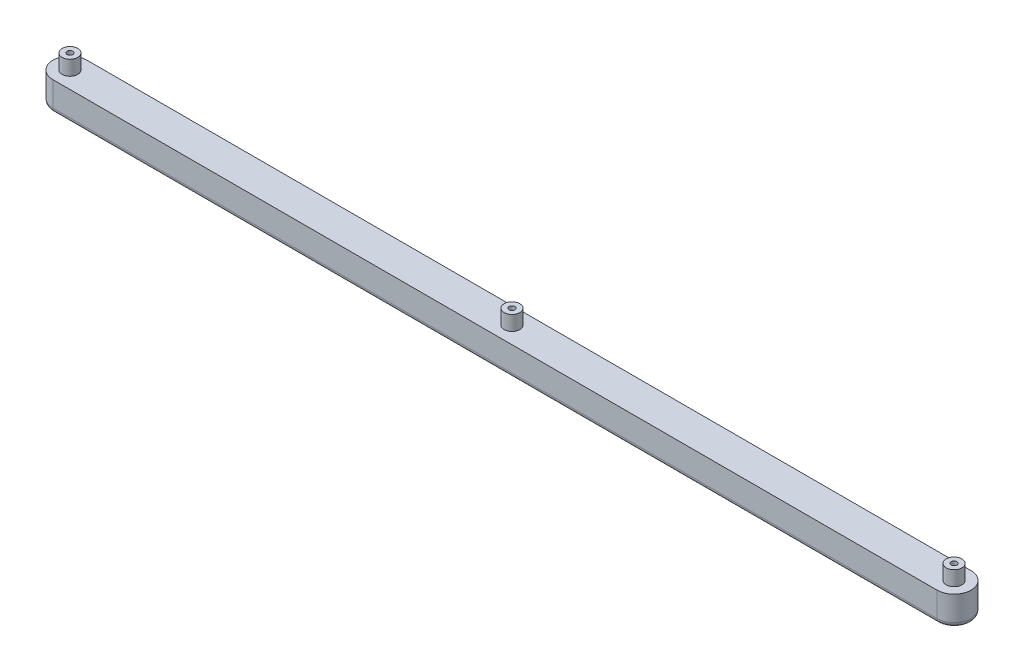
ISO-10303-21;
HEADER;
FILE_DESCRIPTION(('STEP AP214'),'2;1');
FILE_NAME('part.step','',(''),(''),'','','');
FILE_SCHEMA(('AUTOMOTIVE_DESIGN { 1 0 10303 214 1 1 1 1 }'));
ENDSEC;
DATA;
#1=APPLICATION_CONTEXT('core data for automotive mechanical design processes');
#2=APPLICATION_PROTOCOL_DEFINITION('international standard','automotive_design',2000,#1);
#3=PRODUCT_CONTEXT('',#1,'mechanical');
#4=PRODUCT('Part','Part','',(#3));
#5=PRODUCT_RELATED_PRODUCT_CATEGORY('part','',(#4));
#6=PRODUCT_DEFINITION_FORMATION('','',#4);
#7=PRODUCT_DEFINITION_CONTEXT('part definition',#1,'design');
#8=PRODUCT_DEFINITION('design','',#6,#7);
#9=PRODUCT_DEFINITION_SHAPE('','',#8);
#10=(LENGTH_UNIT() NAMED_UNIT(*) SI_UNIT(.MILLI.,.METRE.));
#11=(NAMED_UNIT(*) PLANE_ANGLE_UNIT() SI_UNIT($,.RADIAN.));
#12=(NAMED_UNIT(*) SI_UNIT($,.STERADIAN.) SOLID_ANGLE_UNIT());
#13=UNCERTAINTY_MEASURE_WITH_UNIT(LENGTH_MEASURE(1.E-05),#10,'distance_accuracy_value','');
#14=(GEOMETRIC_REPRESENTATION_CONTEXT(3) GLOBAL_UNCERTAINTY_ASSIGNED_CONTEXT((#13)) GLOBAL_UNIT_ASSIGNED_CONTEXT((#10,
#11,#12)) REPRESENTATION_CONTEXT('',''));
#15=CARTESIAN_POINT('',(0.,0.,0.));
#16=DIRECTION('',(0.,0.,1.));
#17=DIRECTION('',(1.,0.,0.));
#18=AXIS2_PLACEMENT_3D('',#15,#16,#17);
#19=CARTESIAN_POINT('',(-90.,3.,0.));
#20=DIRECTION('',(0.,-1.,0.));
#21=DIRECTION('',(0.,0.,-1.));
#22=AXIS2_PLACEMENT_3D('',#19,#20,#21);
#23=CYLINDRICAL_SURFACE('',#22,3.44999999998838);
#24=DIRECTION('',(0.,-1.,0.));
#25=VECTOR('',#24,1.);
#26=CARTESIAN_POINT('',(-90.,3.,-3.44999999998838));
#27=LINE('',#26,#25);
#28=CARTESIAN_POINT('',(-90.,3.,-3.44999999998838));
#29=VERTEX_POINT('',#28);
#30=CARTESIAN_POINT('',(-90.,-2.,-3.44999999998838));
#31=VERTEX_POINT('',#30);
#32=EDGE_CURVE('E160',#29,#31,#27,.T.);
#33=ORIENTED_EDGE('',*,*,#32,.T.);
#34=CARTESIAN_POINT('',(-90.,-2.,0.));
#35=DIRECTION('',(0.,1.,0.));
#36=DIRECTION('',(0.,0.,1.));
#37=AXIS2_PLACEMENT_3D('',#34,#35,#36);
#38=CIRCLE('',#37,3.44999999998838);
#39=CARTESIAN_POINT('',(-90.,-2.,3.44999999998838));
#40=VERTEX_POINT('',#39);
#41=EDGE_CURVE('E11',#31,#40,#38,.T.);
#42=ORIENTED_EDGE('',*,*,#41,.T.);
#43=DIRECTION('',(0.,-1.,0.));
#44=VECTOR('',#43,1.);
#45=CARTESIAN_POINT('',(-90.,3.,3.44999999998838));
#46=LINE('',#45,#44);
#47=CARTESIAN_POINT('',(-90.,3.,3.44999999998838));
#48=VERTEX_POINT('',#47);
#49=EDGE_CURVE('E100',#48,#40,#46,.T.);
#50=ORIENTED_EDGE('',*,*,#49,.F.);
#51=CARTESIAN_POINT('',(-90.,3.,0.));
#52=DIRECTION('',(0.,1.,0.));
#53=DIRECTION('',(0.,0.,1.));
#54=AXIS2_PLACEMENT_3D('',#51,#52,#53);
#55=CIRCLE('',#54,3.44999999998838);
#56=EDGE_CURVE('E106',#29,#48,#55,.T.);
#57=ORIENTED_EDGE('',*,*,#56,.F.);
#58=EDGE_LOOP('',(#33,#42,#50,#57));
#59=FACE_BOUND('',#58,.T.);
#60=ADVANCED_FACE('F39',(#59),#23,.T.);
#61=CARTESIAN_POINT('',(-90.,3.,3.44999999998838));
#62=DIRECTION('',(0.,0.,-1.));
#63=DIRECTION('',(-1.,0.,0.));
#64=AXIS2_PLACEMENT_3D('',#61,#62,#63);
#65=PLANE('',#64);
#66=ORIENTED_EDGE('',*,*,#49,.T.);
#67=DIRECTION('',(1.,0.,0.));
#68=VECTOR('',#67,1.);
#69=CARTESIAN_POINT('',(-90.,-2.,3.44999999998838));
#70=LINE('',#69,#68);
#71=CARTESIAN_POINT('',(90.,-2.,3.44999999998838));
#72=VERTEX_POINT('',#71);
#73=EDGE_CURVE('E116',#40,#72,#70,.T.);
#74=ORIENTED_EDGE('',*,*,#73,.T.);
#75=DIRECTION('',(0.,-1.,0.));
#76=VECTOR('',#75,1.);
#77=CARTESIAN_POINT('',(90.,3.,3.44999999998838));
#78=LINE('',#77,#76);
#79=CARTESIAN_POINT('',(90.,3.,3.44999999998838));
#80=VERTEX_POINT('',#79);
#81=EDGE_CURVE('E102',#80,#72,#78,.T.);
#82=ORIENTED_EDGE('',*,*,#81,.F.);
#83=DIRECTION('',(1.,0.,0.));
#84=VECTOR('',#83,1.);
#85=CARTESIAN_POINT('',(-90.,3.,3.44999999998838));
#86=LINE('',#85,#84);
#87=EDGE_CURVE('E95',#48,#80,#86,.T.);
#88=ORIENTED_EDGE('',*,*,#87,.F.);
#89=EDGE_LOOP('',(#66,#74,#82,#88));
#90=FACE_BOUND('',#89,.T.);
#91=ADVANCED_FACE('F97',(#90),#65,.F.);
#92=CARTESIAN_POINT('',(90.,3.,0.));
#93=DIRECTION('',(0.,-1.,0.));
#94=DIRECTION('',(0.,0.,-1.));
#95=AXIS2_PLACEMENT_3D('',#92,#93,#94);
#96=CYLINDRICAL_SURFACE('',#95,3.44999999998838);
#97=ORIENTED_EDGE('',*,*,#81,.T.);
#98=CARTESIAN_POINT('',(90.,-2.,0.));
#99=DIRECTION('',(0.,1.,0.));
#100=DIRECTION('',(0.,0.,1.));
#101=AXIS2_PLACEMENT_3D('',#98,#99,#100);
#102=CIRCLE('',#101,3.44999999998838);
#103=CARTESIAN_POINT('',(90.,-2.,-3.44999999998838));
#104=VERTEX_POINT('',#103);
#105=EDGE_CURVE('E63',#72,#104,#102,.T.);
#106=ORIENTED_EDGE('',*,*,#105,.T.);
#107=DIRECTION('',(0.,-1.,0.));
#108=VECTOR('',#107,1.);
#109=CARTESIAN_POINT('',(90.,3.,-3.44999999998838));
#110=LINE('',#109,#108);
#111=CARTESIAN_POINT('',(90.,3.,-3.44999999998838));
#112=VERTEX_POINT('',#111);
#113=EDGE_CURVE('E120',#112,#104,#110,.T.);
#114=ORIENTED_EDGE('',*,*,#113,.F.);
#115=CARTESIAN_POINT('',(90.,3.,0.));
#116=DIRECTION('',(0.,1.,0.));
#117=DIRECTION('',(0.,0.,1.));
#118=AXIS2_PLACEMENT_3D('',#115,#116,#117);
#119=CIRCLE('',#118,3.44999999998838);
#120=EDGE_CURVE('E105',#80,#112,#119,.T.);
#121=ORIENTED_EDGE('',*,*,#120,.F.);
#122=EDGE_LOOP('',(#97,#106,#114,#121));
#123=FACE_BOUND('',#122,.T.);
#124=ADVANCED_FACE('F170',(#123),#96,.T.);
#125=CARTESIAN_POINT('',(-90.,3.,-3.44999999998838));
#126=DIRECTION('',(0.,0.,1.));
#127=DIRECTION('',(1.,0.,0.));
#128=AXIS2_PLACEMENT_3D('',#125,#126,#127);
#129=PLANE('',#128);
#130=ORIENTED_EDGE('',*,*,#113,.T.);
#131=DIRECTION('',(-1.,0.,0.));
#132=VECTOR('',#131,1.);
#133=CARTESIAN_POINT('',(-90.,-2.,-3.44999999998838));
#134=LINE('',#133,#132);
#135=EDGE_CURVE('E48',#104,#31,#134,.T.);
#136=ORIENTED_EDGE('',*,*,#135,.T.);
#137=ORIENTED_EDGE('',*,*,#32,.F.);
#138=DIRECTION('',(-1.,0.,0.));
#139=VECTOR('',#138,1.);
#140=CARTESIAN_POINT('',(-90.,3.,-3.44999999998838));
#141=LINE('',#140,#139);
#142=EDGE_CURVE('E111',#112,#29,#141,.T.);
#143=ORIENTED_EDGE('',*,*,#142,.F.);
#144=EDGE_LOOP('',(#130,#136,#137,#143));
#145=FACE_BOUND('',#144,.T.);
#146=ADVANCED_FACE('F161',(#145),#129,.F.);
#147=CARTESIAN_POINT('',(-90.,3.,0.));
#148=DIRECTION('',(0.,1.,0.));
#149=DIRECTION('',(0.,0.,1.));
#150=AXIS2_PLACEMENT_3D('',#147,#148,#149);
#151=PLANE('',#150);
#152=CARTESIAN_POINT('',(-90.,3.,0.));
#153=DIRECTION('',(0.,1.,0.));
#154=DIRECTION('',(0.,0.,1.));
#155=AXIS2_PLACEMENT_3D('',#152,#153,#154);
#156=CIRCLE('',#155,1.58999999999999);
#157=CARTESIAN_POINT('',(-90.,3.,1.58999999999999));
#158=VERTEX_POINT('',#157);
#159=EDGE_CURVE('E256',#158,#158,#156,.T.);
#160=ORIENTED_EDGE('',*,*,#159,.F.);
#161=EDGE_LOOP('',(#160));
#162=FACE_BOUND('',#161,.T.);
#163=CARTESIAN_POINT('',(90.,3.,0.));
#164=DIRECTION('',(0.,1.,0.));
#165=DIRECTION('',(0.,0.,1.));
#166=AXIS2_PLACEMENT_3D('',#163,#164,#165);
#167=CIRCLE('',#166,1.58999999999999);
#168=CARTESIAN_POINT('',(90.,3.,1.58999999999996));
#169=VERTEX_POINT('',#168);
#170=EDGE_CURVE('E259',#169,#169,#167,.T.);
#171=ORIENTED_EDGE('',*,*,#170,.F.);
#172=EDGE_LOOP('',(#171));
#173=FACE_BOUND('',#172,.T.);
#174=CARTESIAN_POINT('',(0.,3.,0.));
#175=DIRECTION('',(0.,1.,0.));
#176=DIRECTION('',(0.,0.,1.));
#177=AXIS2_PLACEMENT_3D('',#174,#175,#176);
#178=CIRCLE('',#177,1.59);
#179=CARTESIAN_POINT('',(0.,3.,1.59));
#180=VERTEX_POINT('',#179);
#181=EDGE_CURVE('E149',#180,#180,#178,.T.);
#182=ORIENTED_EDGE('',*,*,#181,.F.);
#183=EDGE_LOOP('',(#182));
#184=FACE_BOUND('',#183,.T.);
#185=ORIENTED_EDGE('',*,*,#56,.T.);
#186=ORIENTED_EDGE('',*,*,#87,.T.);
#187=ORIENTED_EDGE('',*,*,#120,.T.);
#188=ORIENTED_EDGE('',*,*,#142,.T.);
#189=EDGE_LOOP('',(#185,#186,#187,#188));
#190=FACE_BOUND('',#189,.T.);
#191=ADVANCED_FACE('F109',(#162,#173,#184,#190),#151,.T.);
#192=CARTESIAN_POINT('',(-90.,-3.,0.));
#193=DIRECTION('',(0.,1.,0.));
#194=DIRECTION('',(0.,0.,1.));
#195=AXIS2_PLACEMENT_3D('',#192,#193,#194);
#196=PLANE('',#195);
#197=CARTESIAN_POINT('',(90.,-3.,0.));
#198=DIRECTION('',(0.,1.,0.));
#199=DIRECTION('',(0.,0.,1.));
#200=AXIS2_PLACEMENT_3D('',#197,#198,#199);
#201=CIRCLE('',#200,0.589999999999996);
#202=CARTESIAN_POINT('',(90.,-3.,0.589999999999963));
#203=VERTEX_POINT('',#202);
#204=EDGE_CURVE('E137',#203,#203,#201,.T.);
#205=ORIENTED_EDGE('',*,*,#204,.T.);
#206=EDGE_LOOP('',(#205));
#207=FACE_BOUND('',#206,.T.);
#208=CARTESIAN_POINT('',(-90.,-3.,0.));
#209=DIRECTION('',(0.,1.,0.));
#210=DIRECTION('',(0.,0.,1.));
#211=AXIS2_PLACEMENT_3D('',#208,#209,#210);
#212=CIRCLE('',#211,0.589999999999996);
#213=CARTESIAN_POINT('',(-90.,-3.,0.589999999999996));
#214=VERTEX_POINT('',#213);
#215=EDGE_CURVE('E242',#214,#214,#212,.T.);
#216=ORIENTED_EDGE('',*,*,#215,.T.);
#217=EDGE_LOOP('',(#216));
#218=FACE_BOUND('',#217,.T.);
#219=CARTESIAN_POINT('',(0.,-3.,0.));
#220=DIRECTION('',(0.,1.,0.));
#221=DIRECTION('',(0.,0.,1.));
#222=AXIS2_PLACEMENT_3D('',#219,#220,#221);
#223=CIRCLE('',#222,0.59);
#224=CARTESIAN_POINT('',(0.,-3.,0.59));
#225=VERTEX_POINT('',#224);
#226=EDGE_CURVE('E246',#225,#225,#223,.T.);
#227=ORIENTED_EDGE('',*,*,#226,.T.);
#228=EDGE_LOOP('',(#227));
#229=FACE_BOUND('',#228,.T.);
#230=CARTESIAN_POINT('',(90.,-3.,0.));
#231=DIRECTION('',(0.,1.,0.));
#232=DIRECTION('',(0.,0.,1.));
#233=AXIS2_PLACEMENT_3D('',#230,#231,#232);
#234=CIRCLE('',#233,2.44999999998838);
#235=CARTESIAN_POINT('',(90.,-3.,-2.44999999998838));
#236=VERTEX_POINT('',#235);
#237=CARTESIAN_POINT('',(90.,-3.,2.44999999998838));
#238=VERTEX_POINT('',#237);
#239=EDGE_CURVE('E127',#236,#238,#234,.F.);
#240=ORIENTED_EDGE('',*,*,#239,.T.);
#241=DIRECTION('',(1.,0.,0.));
#242=VECTOR('',#241,1.);
#243=CARTESIAN_POINT('',(-90.,-3.,2.44999999998838));
#244=LINE('',#243,#242);
#245=CARTESIAN_POINT('',(-90.,-3.,2.44999999998838));
#246=VERTEX_POINT('',#245);
#247=EDGE_CURVE('E129',#238,#246,#244,.F.);
#248=ORIENTED_EDGE('',*,*,#247,.T.);
#249=CARTESIAN_POINT('',(-90.,-3.,0.));
#250=DIRECTION('',(0.,1.,0.));
#251=DIRECTION('',(0.,0.,1.));
#252=AXIS2_PLACEMENT_3D('',#249,#250,#251);
#253=CIRCLE('',#252,2.44999999998838);
#254=CARTESIAN_POINT('',(-90.,-3.,-2.44999999998838));
#255=VERTEX_POINT('',#254);
#256=EDGE_CURVE('E118',#246,#255,#253,.F.);
#257=ORIENTED_EDGE('',*,*,#256,.T.);
#258=DIRECTION('',(-1.,0.,0.));
#259=VECTOR('',#258,1.);
#260=CARTESIAN_POINT('',(-90.,-3.,-2.44999999998838));
#261=LINE('',#260,#259);
#262=EDGE_CURVE('E125',#255,#236,#261,.F.);
#263=ORIENTED_EDGE('',*,*,#262,.T.);
#264=EDGE_LOOP('',(#240,#248,#257,#263));
#265=FACE_BOUND('',#264,.T.);
#266=ADVANCED_FACE('F224',(#207,#218,#229,#265),#196,.F.);
#267=CARTESIAN_POINT('',(0.,6.,0.));
#268=DIRECTION('',(0.,-1.,0.));
#269=DIRECTION('',(0.,0.,-1.));
#270=AXIS2_PLACEMENT_3D('',#267,#268,#269);
#271=CYLINDRICAL_SURFACE('',#270,1.59);
#272=CARTESIAN_POINT('',(0.,6.,0.));
#273=DIRECTION('',(0.,1.,0.));
#274=DIRECTION('',(0.,0.,1.));
#275=AXIS2_PLACEMENT_3D('',#272,#273,#274);
#276=CIRCLE('',#275,1.59);
#277=CARTESIAN_POINT('',(0.,6.,1.59));
#278=VERTEX_POINT('',#277);
#279=EDGE_CURVE('E144',#278,#278,#276,.T.);
#280=ORIENTED_EDGE('',*,*,#279,.F.);
#281=EDGE_LOOP('',(#280));
#282=FACE_BOUND('',#281,.T.);
#283=ORIENTED_EDGE('',*,*,#181,.T.);
#284=EDGE_LOOP('',(#283));
#285=FACE_BOUND('',#284,.T.);
#286=ADVANCED_FACE('F221',(#282,#285),#271,.T.);
#287=CARTESIAN_POINT('',(0.,6.,0.));
#288=DIRECTION('',(0.,1.,0.));
#289=DIRECTION('',(0.,0.,1.));
#290=AXIS2_PLACEMENT_3D('',#287,#288,#289);
#291=PLANE('',#290);
#292=CARTESIAN_POINT('',(0.,6.,0.));
#293=DIRECTION('',(0.,1.,0.));
#294=DIRECTION('',(0.,0.,1.));
#295=AXIS2_PLACEMENT_3D('',#292,#293,#294);
#296=CIRCLE('',#295,0.59);
#297=CARTESIAN_POINT('',(0.,6.,0.59));
#298=VERTEX_POINT('',#297);
#299=EDGE_CURVE('E248',#298,#298,#296,.T.);
#300=ORIENTED_EDGE('',*,*,#299,.F.);
#301=EDGE_LOOP('',(#300));
#302=FACE_BOUND('',#301,.T.);
#303=ORIENTED_EDGE('',*,*,#279,.T.);
#304=EDGE_LOOP('',(#303));
#305=FACE_BOUND('',#304,.T.);
#306=ADVANCED_FACE('F217',(#302,#305),#291,.T.);
#307=CARTESIAN_POINT('',(90.,6.,0.));
#308=DIRECTION('',(0.,-1.,0.));
#309=DIRECTION('',(0.,0.,-1.));
#310=AXIS2_PLACEMENT_3D('',#307,#308,#309);
#311=CYLINDRICAL_SURFACE('',#310,1.58999999999999);
#312=CARTESIAN_POINT('',(90.,6.,0.));
#313=DIRECTION('',(0.,1.,0.));
#314=DIRECTION('',(0.,0.,1.));
#315=AXIS2_PLACEMENT_3D('',#312,#313,#314);
#316=CIRCLE('',#315,1.58999999999999);
#317=CARTESIAN_POINT('',(90.,6.,1.58999999999996));
#318=VERTEX_POINT('',#317);
#319=EDGE_CURVE('E154',#318,#318,#316,.T.);
#320=ORIENTED_EDGE('',*,*,#319,.F.);
#321=EDGE_LOOP('',(#320));
#322=FACE_BOUND('',#321,.T.);
#323=ORIENTED_EDGE('',*,*,#170,.T.);
#324=EDGE_LOOP('',(#323));
#325=FACE_BOUND('',#324,.T.);
#326=ADVANCED_FACE('F214',(#322,#325),#311,.T.);
#327=CARTESIAN_POINT('',(90.,6.,0.));
#328=DIRECTION('',(0.,1.,0.));
#329=DIRECTION('',(0.,0.,1.));
#330=AXIS2_PLACEMENT_3D('',#327,#328,#329);
#331=PLANE('',#330);
#332=CARTESIAN_POINT('',(90.,6.,0.));
#333=DIRECTION('',(0.,1.,0.));
#334=DIRECTION('',(0.,0.,1.));
#335=AXIS2_PLACEMENT_3D('',#332,#333,#334);
#336=CIRCLE('',#335,0.589999999999996);
#337=CARTESIAN_POINT('',(90.,6.,0.589999999999963));
#338=VERTEX_POINT('',#337);
#339=EDGE_CURVE('E277',#338,#338,#336,.T.);
#340=ORIENTED_EDGE('',*,*,#339,.F.);
#341=EDGE_LOOP('',(#340));
#342=FACE_BOUND('',#341,.T.);
#343=ORIENTED_EDGE('',*,*,#319,.T.);
#344=EDGE_LOOP('',(#343));
#345=FACE_BOUND('',#344,.T.);
#346=ADVANCED_FACE('F205',(#342,#345),#331,.T.);
#347=CARTESIAN_POINT('',(-90.,6.,0.));
#348=DIRECTION('',(0.,-1.,0.));
#349=DIRECTION('',(0.,0.,-1.));
#350=AXIS2_PLACEMENT_3D('',#347,#348,#349);
#351=CYLINDRICAL_SURFACE('',#350,1.58999999999999);
#352=CARTESIAN_POINT('',(-90.,6.,0.));
#353=DIRECTION('',(0.,1.,0.));
#354=DIRECTION('',(0.,0.,1.));
#355=AXIS2_PLACEMENT_3D('',#352,#353,#354);
#356=CIRCLE('',#355,1.58999999999999);
#357=CARTESIAN_POINT('',(-90.,6.,1.58999999999999));
#358=VERTEX_POINT('',#357);
#359=EDGE_CURVE('E113',#358,#358,#356,.T.);
#360=ORIENTED_EDGE('',*,*,#359,.F.);
#361=EDGE_LOOP('',(#360));
#362=FACE_BOUND('',#361,.T.);
#363=ORIENTED_EDGE('',*,*,#159,.T.);
#364=EDGE_LOOP('',(#363));
#365=FACE_BOUND('',#364,.T.);
#366=ADVANCED_FACE('F198',(#362,#365),#351,.T.);
#367=CARTESIAN_POINT('',(-90.,6.,0.));
#368=DIRECTION('',(0.,1.,0.));
#369=DIRECTION('',(0.,0.,1.));
#370=AXIS2_PLACEMENT_3D('',#367,#368,#369);
#371=PLANE('',#370);
#372=CARTESIAN_POINT('',(-90.,6.,0.));
#373=DIRECTION('',(0.,1.,0.));
#374=DIRECTION('',(0.,0.,1.));
#375=AXIS2_PLACEMENT_3D('',#372,#373,#374);
#376=CIRCLE('',#375,0.589999999999996);
#377=CARTESIAN_POINT('',(-90.,6.,0.589999999999996));
#378=VERTEX_POINT('',#377);
#379=EDGE_CURVE('E274',#378,#378,#376,.T.);
#380=ORIENTED_EDGE('',*,*,#379,.F.);
#381=EDGE_LOOP('',(#380));
#382=FACE_BOUND('',#381,.T.);
#383=ORIENTED_EDGE('',*,*,#359,.T.);
#384=EDGE_LOOP('',(#383));
#385=FACE_BOUND('',#384,.T.);
#386=ADVANCED_FACE('F194',(#382,#385),#371,.T.);
#387=CARTESIAN_POINT('',(-90.,-2.,-2.44999999998838));
#388=DIRECTION('',(-1.,0.,0.));
#389=DIRECTION('',(0.,0.,1.));
#390=AXIS2_PLACEMENT_3D('',#387,#388,#389);
#391=CYLINDRICAL_SURFACE('',#390,1.);
#392=CARTESIAN_POINT('',(90.,-2.,-2.44999999998838));
#393=DIRECTION('',(1.,0.,0.));
#394=DIRECTION('',(0.,0.,-1.));
#395=AXIS2_PLACEMENT_3D('',#392,#393,#394);
#396=CIRCLE('',#395,1.);
#397=EDGE_CURVE('E138',#236,#104,#396,.T.);
#398=ORIENTED_EDGE('',*,*,#397,.F.);
#399=ORIENTED_EDGE('',*,*,#262,.F.);
#400=CARTESIAN_POINT('',(-90.,-2.,-2.44999999998838));
#401=DIRECTION('',(-1.,0.,0.));
#402=DIRECTION('',(0.,0.,1.));
#403=AXIS2_PLACEMENT_3D('',#400,#401,#402);
#404=CIRCLE('',#403,1.);
#405=EDGE_CURVE('E43',#31,#255,#404,.T.);
#406=ORIENTED_EDGE('',*,*,#405,.F.);
#407=ORIENTED_EDGE('',*,*,#135,.F.);
#408=EDGE_LOOP('',(#398,#399,#406,#407));
#409=FACE_BOUND('',#408,.T.);
#410=ADVANCED_FACE('F41',(#409),#391,.T.);
#411=CARTESIAN_POINT('',(-90.,-2.,0.));
#412=DIRECTION('',(0.,1.,0.));
#413=DIRECTION('',(0.,0.,1.));
#414=AXIS2_PLACEMENT_3D('',#411,#412,#413);
#415=TOROIDAL_SURFACE('',#414,2.44999999998838,1.);
#416=ORIENTED_EDGE('',*,*,#405,.T.);
#417=ORIENTED_EDGE('',*,*,#256,.F.);
#418=CARTESIAN_POINT('',(-90.,-2.,2.44999999998838));
#419=DIRECTION('',(1.,0.,0.));
#420=DIRECTION('',(0.,0.,-1.));
#421=AXIS2_PLACEMENT_3D('',#418,#419,#420);
#422=CIRCLE('',#421,1.);
#423=EDGE_CURVE('E136',#40,#246,#422,.T.);
#424=ORIENTED_EDGE('',*,*,#423,.F.);
#425=ORIENTED_EDGE('',*,*,#41,.F.);
#426=EDGE_LOOP('',(#416,#417,#424,#425));
#427=FACE_BOUND('',#426,.T.);
#428=ADVANCED_FACE('F164',(#427),#415,.T.);
#429=CARTESIAN_POINT('',(90.,-2.,0.));
#430=DIRECTION('',(0.,1.,0.));
#431=DIRECTION('',(0.,0.,1.));
#432=AXIS2_PLACEMENT_3D('',#429,#430,#431);
#433=TOROIDAL_SURFACE('',#432,2.44999999998838,1.);
#434=ORIENTED_EDGE('',*,*,#397,.T.);
#435=ORIENTED_EDGE('',*,*,#105,.F.);
#436=CARTESIAN_POINT('',(90.,-2.,2.44999999998838));
#437=DIRECTION('',(-1.,0.,0.));
#438=DIRECTION('',(0.,0.,1.));
#439=AXIS2_PLACEMENT_3D('',#436,#437,#438);
#440=CIRCLE('',#439,1.);
#441=EDGE_CURVE('E134',#238,#72,#440,.T.);
#442=ORIENTED_EDGE('',*,*,#441,.F.);
#443=ORIENTED_EDGE('',*,*,#239,.F.);
#444=EDGE_LOOP('',(#434,#435,#442,#443));
#445=FACE_BOUND('',#444,.T.);
#446=ADVANCED_FACE('F188',(#445),#433,.T.);
#447=CARTESIAN_POINT('',(-90.,-2.,2.44999999998838));
#448=DIRECTION('',(1.,0.,0.));
#449=DIRECTION('',(0.,0.,-1.));
#450=AXIS2_PLACEMENT_3D('',#447,#448,#449);
#451=CYLINDRICAL_SURFACE('',#450,1.);
#452=ORIENTED_EDGE('',*,*,#423,.T.);
#453=ORIENTED_EDGE('',*,*,#247,.F.);
#454=ORIENTED_EDGE('',*,*,#441,.T.);
#455=ORIENTED_EDGE('',*,*,#73,.F.);
#456=EDGE_LOOP('',(#452,#453,#454,#455));
#457=FACE_BOUND('',#456,.T.);
#458=ADVANCED_FACE('F168',(#457),#451,.T.);
#459=CARTESIAN_POINT('',(-90.,-3.,0.));
#460=DIRECTION('',(0.,1.,0.));
#461=DIRECTION('',(0.,0.,1.));
#462=AXIS2_PLACEMENT_3D('',#459,#460,#461);
#463=CYLINDRICAL_SURFACE('',#462,0.589999999999996);
#464=ORIENTED_EDGE('',*,*,#215,.F.);
#465=EDGE_LOOP('',(#464));
#466=FACE_BOUND('',#465,.T.);
#467=ORIENTED_EDGE('',*,*,#379,.T.);
#468=EDGE_LOOP('',(#467));
#469=FACE_BOUND('',#468,.T.);
#470=ADVANCED_FACE('F187',(#466,#469),#463,.F.);
#471=CARTESIAN_POINT('',(90.,-3.,0.));
#472=DIRECTION('',(0.,1.,0.));
#473=DIRECTION('',(0.,0.,1.));
#474=AXIS2_PLACEMENT_3D('',#471,#472,#473);
#475=CYLINDRICAL_SURFACE('',#474,0.589999999999996);
#476=ORIENTED_EDGE('',*,*,#204,.F.);
#477=EDGE_LOOP('',(#476));
#478=FACE_BOUND('',#477,.T.);
#479=ORIENTED_EDGE('',*,*,#339,.T.);
#480=EDGE_LOOP('',(#479));
#481=FACE_BOUND('',#480,.T.);
#482=ADVANCED_FACE('F282',(#478,#481),#475,.F.);
#483=CARTESIAN_POINT('',(0.,-3.,0.));
#484=DIRECTION('',(0.,1.,0.));
#485=DIRECTION('',(0.,0.,1.));
#486=AXIS2_PLACEMENT_3D('',#483,#484,#485);
#487=CYLINDRICAL_SURFACE('',#486,0.59);
#488=ORIENTED_EDGE('',*,*,#226,.F.);
#489=EDGE_LOOP('',(#488));
#490=FACE_BOUND('',#489,.T.);
#491=ORIENTED_EDGE('',*,*,#299,.T.);
#492=EDGE_LOOP('',(#491));
#493=FACE_BOUND('',#492,.T.);
#494=ADVANCED_FACE('F211',(#490,#493),#487,.F.);
#495=CLOSED_SHELL('',(#60,#91,#124,#146,#191,#266,#286,#306,#326,#346,#366,#386,#410,#428,#446,
#458,#470,#482,#494));
#496=MANIFOLD_SOLID_BREP('B2',#495);
#497=ADVANCED_BREP_SHAPE_REPRESENTATION('',(#18,#496),#14);
#498=SHAPE_DEFINITION_REPRESENTATION(#9,#497);
ENDSEC;
END-ISO-10303-21;
